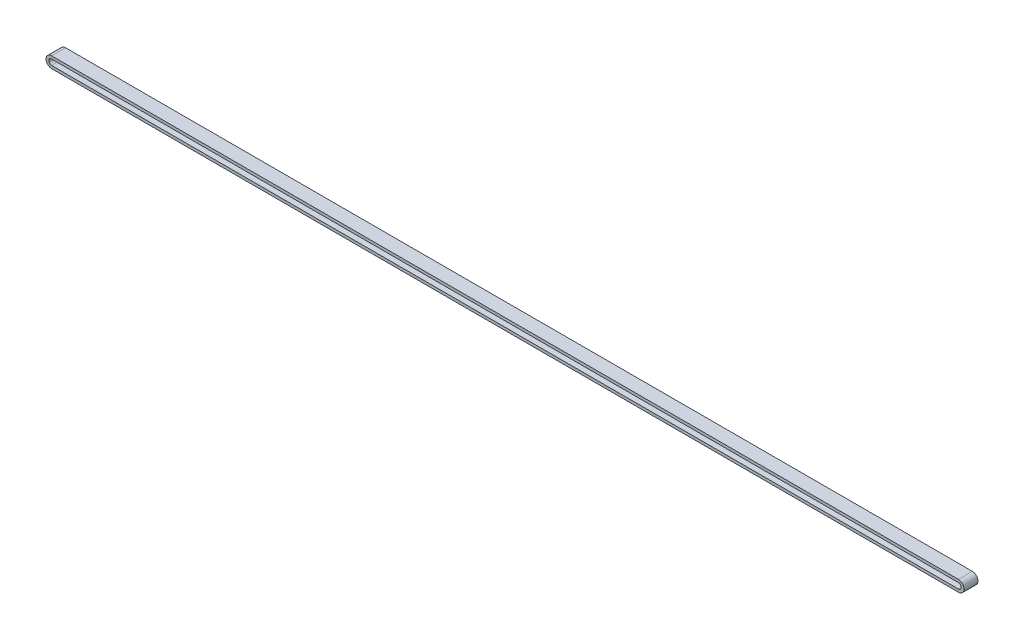
ISO-10303-21;
HEADER;
FILE_DESCRIPTION(('STEP AP214'),'2;1');
FILE_NAME('part.step','',(''),(''),'','','');
FILE_SCHEMA(('AUTOMOTIVE_DESIGN { 1 0 10303 214 1 1 1 1 }'));
ENDSEC;
DATA;
#1=APPLICATION_CONTEXT('core data for automotive mechanical design processes');
#2=APPLICATION_PROTOCOL_DEFINITION('international standard','automotive_design',2000,#1);
#3=PRODUCT_CONTEXT('',#1,'mechanical');
#4=PRODUCT('Part','Part','',(#3));
#5=PRODUCT_RELATED_PRODUCT_CATEGORY('part','',(#4));
#6=PRODUCT_DEFINITION_FORMATION('','',#4);
#7=PRODUCT_DEFINITION_CONTEXT('part definition',#1,'design');
#8=PRODUCT_DEFINITION('design','',#6,#7);
#9=PRODUCT_DEFINITION_SHAPE('','',#8);
#10=(LENGTH_UNIT() NAMED_UNIT(*) SI_UNIT(.MILLI.,.METRE.));
#11=(NAMED_UNIT(*) PLANE_ANGLE_UNIT() SI_UNIT($,.RADIAN.));
#12=(NAMED_UNIT(*) SI_UNIT($,.STERADIAN.) SOLID_ANGLE_UNIT());
#13=UNCERTAINTY_MEASURE_WITH_UNIT(LENGTH_MEASURE(1.E-05),#10,'distance_accuracy_value','');
#14=(GEOMETRIC_REPRESENTATION_CONTEXT(3) GLOBAL_UNCERTAINTY_ASSIGNED_CONTEXT((#13)) GLOBAL_UNIT_ASSIGNED_CONTEXT((#10,
#11,#12)) REPRESENTATION_CONTEXT('',''));
#15=CARTESIAN_POINT('',(0.,0.,0.));
#16=DIRECTION('',(0.,0.,1.));
#17=DIRECTION('',(1.,0.,0.));
#18=AXIS2_PLACEMENT_3D('',#15,#16,#17);
#19=CARTESIAN_POINT('',(0.,0.,5.));
#20=DIRECTION('',(0.,0.,-1.));
#21=DIRECTION('',(-1.,0.,0.));
#22=AXIS2_PLACEMENT_3D('',#19,#20,#21);
#23=CYLINDRICAL_SURFACE('',#22,2.);
#24=CARTESIAN_POINT('',(0.,0.,0.));
#25=DIRECTION('',(0.,0.,1.));
#26=DIRECTION('',(1.,0.,0.));
#27=AXIS2_PLACEMENT_3D('',#24,#25,#26);
#28=CIRCLE('',#27,2.);
#29=CARTESIAN_POINT('',(0.,2.,0.));
#30=VERTEX_POINT('',#29);
#31=CARTESIAN_POINT('',(0.,-2.,0.));
#32=VERTEX_POINT('',#31);
#33=EDGE_CURVE('E143',#30,#32,#28,.T.);
#34=ORIENTED_EDGE('',*,*,#33,.T.);
#35=DIRECTION('',(0.,0.,-1.));
#36=VECTOR('',#35,1.);
#37=CARTESIAN_POINT('',(0.,-2.,5.));
#38=LINE('',#37,#36);
#39=CARTESIAN_POINT('',(0.,-2.,5.));
#40=VERTEX_POINT('',#39);
#41=EDGE_CURVE('E11',#40,#32,#38,.T.);
#42=ORIENTED_EDGE('',*,*,#41,.F.);
#43=CARTESIAN_POINT('',(0.,0.,5.));
#44=DIRECTION('',(0.,0.,1.));
#45=DIRECTION('',(1.,0.,0.));
#46=AXIS2_PLACEMENT_3D('',#43,#44,#45);
#47=CIRCLE('',#46,2.);
#48=CARTESIAN_POINT('',(0.,2.,5.));
#49=VERTEX_POINT('',#48);
#50=EDGE_CURVE('E114',#49,#40,#47,.T.);
#51=ORIENTED_EDGE('',*,*,#50,.F.);
#52=DIRECTION('',(0.,0.,-1.));
#53=VECTOR('',#52,1.);
#54=CARTESIAN_POINT('',(0.,2.,5.));
#55=LINE('',#54,#53);
#56=EDGE_CURVE('E54',#49,#30,#55,.T.);
#57=ORIENTED_EDGE('',*,*,#56,.T.);
#58=EDGE_LOOP('',(#34,#42,#51,#57));
#59=FACE_BOUND('',#58,.T.);
#60=ADVANCED_FACE('F35',(#59),#23,.T.);
#61=CARTESIAN_POINT('',(0.,-2.,5.));
#62=DIRECTION('',(0.,1.,0.));
#63=DIRECTION('',(0.,0.,1.));
#64=AXIS2_PLACEMENT_3D('',#61,#62,#63);
#65=PLANE('',#64);
#66=DIRECTION('',(1.,0.,0.));
#67=VECTOR('',#66,1.);
#68=CARTESIAN_POINT('',(0.,-2.,0.));
#69=LINE('',#68,#67);
#70=CARTESIAN_POINT('',(325.00227405,-2.,0.));
#71=VERTEX_POINT('',#70);
#72=EDGE_CURVE('E120',#32,#71,#69,.T.);
#73=ORIENTED_EDGE('',*,*,#72,.T.);
#74=DIRECTION('',(0.,0.,-1.));
#75=VECTOR('',#74,1.);
#76=CARTESIAN_POINT('',(325.00227405,-2.,5.));
#77=LINE('',#76,#75);
#78=CARTESIAN_POINT('',(325.00227405,-2.,5.));
#79=VERTEX_POINT('',#78);
#80=EDGE_CURVE('E45',#79,#71,#77,.T.);
#81=ORIENTED_EDGE('',*,*,#80,.F.);
#82=DIRECTION('',(1.,0.,0.));
#83=VECTOR('',#82,1.);
#84=CARTESIAN_POINT('',(0.,-2.,5.));
#85=LINE('',#84,#83);
#86=EDGE_CURVE('E108',#40,#79,#85,.T.);
#87=ORIENTED_EDGE('',*,*,#86,.F.);
#88=ORIENTED_EDGE('',*,*,#41,.T.);
#89=EDGE_LOOP('',(#73,#81,#87,#88));
#90=FACE_BOUND('',#89,.T.);
#91=ADVANCED_FACE('F119',(#90),#65,.F.);
#92=CARTESIAN_POINT('',(325.00227405,0.,5.));
#93=DIRECTION('',(0.,0.,-1.));
#94=DIRECTION('',(-1.,0.,0.));
#95=AXIS2_PLACEMENT_3D('',#92,#93,#94);
#96=CYLINDRICAL_SURFACE('',#95,2.);
#97=CARTESIAN_POINT('',(325.00227405,0.,0.));
#98=DIRECTION('',(0.,0.,1.));
#99=DIRECTION('',(1.,0.,0.));
#100=AXIS2_PLACEMENT_3D('',#97,#98,#99);
#101=CIRCLE('',#100,2.);
#102=CARTESIAN_POINT('',(325.00227405,2.,0.));
#103=VERTEX_POINT('',#102);
#104=EDGE_CURVE('E146',#71,#103,#101,.T.);
#105=ORIENTED_EDGE('',*,*,#104,.T.);
#106=DIRECTION('',(0.,0.,-1.));
#107=VECTOR('',#106,1.);
#108=CARTESIAN_POINT('',(325.00227405,2.,5.));
#109=LINE('',#108,#107);
#110=CARTESIAN_POINT('',(325.00227405,2.,5.));
#111=VERTEX_POINT('',#110);
#112=EDGE_CURVE('E81',#111,#103,#109,.T.);
#113=ORIENTED_EDGE('',*,*,#112,.F.);
#114=CARTESIAN_POINT('',(325.00227405,0.,5.));
#115=DIRECTION('',(0.,0.,1.));
#116=DIRECTION('',(1.,0.,0.));
#117=AXIS2_PLACEMENT_3D('',#114,#115,#116);
#118=CIRCLE('',#117,2.);
#119=EDGE_CURVE('E113',#79,#111,#118,.T.);
#120=ORIENTED_EDGE('',*,*,#119,.F.);
#121=ORIENTED_EDGE('',*,*,#80,.T.);
#122=EDGE_LOOP('',(#105,#113,#120,#121));
#123=FACE_BOUND('',#122,.T.);
#124=ADVANCED_FACE('F124',(#123),#96,.T.);
#125=CARTESIAN_POINT('',(0.,-1.,5.));
#126=DIRECTION('',(0.,1.,0.));
#127=DIRECTION('',(-1.,0.,0.));
#128=AXIS2_PLACEMENT_3D('',#125,#126,#127);
#129=PLANE('',#128);
#130=DIRECTION('',(1.,0.,0.));
#131=VECTOR('',#130,1.);
#132=CARTESIAN_POINT('',(0.,-1.,0.));
#133=LINE('',#132,#131);
#134=CARTESIAN_POINT('',(0.,-1.,0.));
#135=VERTEX_POINT('',#134);
#136=CARTESIAN_POINT('',(325.00227405,-0.999999999999998,0.));
#137=VERTEX_POINT('',#136);
#138=EDGE_CURVE('E131',#135,#137,#133,.T.);
#139=ORIENTED_EDGE('',*,*,#138,.F.);
#140=DIRECTION('',(0.,0.,-1.));
#141=VECTOR('',#140,1.);
#142=CARTESIAN_POINT('',(0.,-1.,5.));
#143=LINE('',#142,#141);
#144=CARTESIAN_POINT('',(0.,-1.,5.));
#145=VERTEX_POINT('',#144);
#146=EDGE_CURVE('E39',#145,#135,#143,.T.);
#147=ORIENTED_EDGE('',*,*,#146,.F.);
#148=DIRECTION('',(1.,0.,0.));
#149=VECTOR('',#148,1.);
#150=CARTESIAN_POINT('',(0.,-1.,5.));
#151=LINE('',#150,#149);
#152=CARTESIAN_POINT('',(325.00227405,-0.999999999999998,5.));
#153=VERTEX_POINT('',#152);
#154=EDGE_CURVE('E151',#145,#153,#151,.T.);
#155=ORIENTED_EDGE('',*,*,#154,.T.);
#156=DIRECTION('',(0.,0.,-1.));
#157=VECTOR('',#156,1.);
#158=CARTESIAN_POINT('',(325.00227405,-0.999999999999998,5.));
#159=LINE('',#158,#157);
#160=EDGE_CURVE('E127',#153,#137,#159,.T.);
#161=ORIENTED_EDGE('',*,*,#160,.T.);
#162=EDGE_LOOP('',(#139,#147,#155,#161));
#163=FACE_BOUND('',#162,.T.);
#164=ADVANCED_FACE('F37',(#163),#129,.T.);
#165=CARTESIAN_POINT('',(0.,0.,5.));
#166=DIRECTION('',(0.,0.,-1.));
#167=DIRECTION('',(-1.,0.,0.));
#168=AXIS2_PLACEMENT_3D('',#165,#166,#167);
#169=CYLINDRICAL_SURFACE('',#168,1.);
#170=CARTESIAN_POINT('',(0.,0.,0.));
#171=DIRECTION('',(0.,0.,1.));
#172=DIRECTION('',(1.,0.,0.));
#173=AXIS2_PLACEMENT_3D('',#170,#171,#172);
#174=CIRCLE('',#173,1.);
#175=CARTESIAN_POINT('',(0.,1.,0.));
#176=VERTEX_POINT('',#175);
#177=EDGE_CURVE('E134',#176,#135,#174,.T.);
#178=ORIENTED_EDGE('',*,*,#177,.F.);
#179=DIRECTION('',(0.,0.,-1.));
#180=VECTOR('',#179,1.);
#181=CARTESIAN_POINT('',(0.,1.,5.));
#182=LINE('',#181,#180);
#183=CARTESIAN_POINT('',(0.,1.,5.));
#184=VERTEX_POINT('',#183);
#185=EDGE_CURVE('E156',#184,#176,#182,.T.);
#186=ORIENTED_EDGE('',*,*,#185,.F.);
#187=CARTESIAN_POINT('',(0.,0.,5.));
#188=DIRECTION('',(0.,0.,1.));
#189=DIRECTION('',(1.,0.,0.));
#190=AXIS2_PLACEMENT_3D('',#187,#188,#189);
#191=CIRCLE('',#190,1.);
#192=EDGE_CURVE('E165',#184,#145,#191,.T.);
#193=ORIENTED_EDGE('',*,*,#192,.T.);
#194=ORIENTED_EDGE('',*,*,#146,.T.);
#195=EDGE_LOOP('',(#178,#186,#193,#194));
#196=FACE_BOUND('',#195,.T.);
#197=ADVANCED_FACE('F163',(#196),#169,.F.);
#198=CARTESIAN_POINT('',(0.,1.,5.));
#199=DIRECTION('',(0.,1.,0.));
#200=DIRECTION('',(-1.,0.,0.));
#201=AXIS2_PLACEMENT_3D('',#198,#199,#200);
#202=PLANE('',#201);
#203=DIRECTION('',(1.,0.,0.));
#204=VECTOR('',#203,1.);
#205=CARTESIAN_POINT('',(0.,1.,0.));
#206=LINE('',#205,#204);
#207=CARTESIAN_POINT('',(325.00227405,0.999999999999998,0.));
#208=VERTEX_POINT('',#207);
#209=EDGE_CURVE('E137',#176,#208,#206,.T.);
#210=ORIENTED_EDGE('',*,*,#209,.T.);
#211=DIRECTION('',(0.,0.,-1.));
#212=VECTOR('',#211,1.);
#213=CARTESIAN_POINT('',(325.00227405,0.999999999999998,5.));
#214=LINE('',#213,#212);
#215=CARTESIAN_POINT('',(325.00227405,0.999999999999998,5.));
#216=VERTEX_POINT('',#215);
#217=EDGE_CURVE('E155',#216,#208,#214,.T.);
#218=ORIENTED_EDGE('',*,*,#217,.F.);
#219=DIRECTION('',(1.,0.,0.));
#220=VECTOR('',#219,1.);
#221=CARTESIAN_POINT('',(0.,1.,5.));
#222=LINE('',#221,#220);
#223=EDGE_CURVE('E173',#184,#216,#222,.T.);
#224=ORIENTED_EDGE('',*,*,#223,.F.);
#225=ORIENTED_EDGE('',*,*,#185,.T.);
#226=EDGE_LOOP('',(#210,#218,#224,#225));
#227=FACE_BOUND('',#226,.T.);
#228=ADVANCED_FACE('F171',(#227),#202,.F.);
#229=CARTESIAN_POINT('',(325.00227405,0.,5.));
#230=DIRECTION('',(0.,0.,-1.));
#231=DIRECTION('',(-1.,0.,0.));
#232=AXIS2_PLACEMENT_3D('',#229,#230,#231);
#233=CYLINDRICAL_SURFACE('',#232,0.999999999999998);
#234=CARTESIAN_POINT('',(325.00227405,0.,0.));
#235=DIRECTION('',(0.,0.,1.));
#236=DIRECTION('',(1.,0.,0.));
#237=AXIS2_PLACEMENT_3D('',#234,#235,#236);
#238=CIRCLE('',#237,0.999999999999998);
#239=EDGE_CURVE('E140',#137,#208,#238,.T.);
#240=ORIENTED_EDGE('',*,*,#239,.F.);
#241=ORIENTED_EDGE('',*,*,#160,.F.);
#242=CARTESIAN_POINT('',(325.00227405,0.,5.));
#243=DIRECTION('',(0.,0.,1.));
#244=DIRECTION('',(1.,0.,0.));
#245=AXIS2_PLACEMENT_3D('',#242,#243,#244);
#246=CIRCLE('',#245,0.999999999999998);
#247=EDGE_CURVE('E176',#153,#216,#246,.T.);
#248=ORIENTED_EDGE('',*,*,#247,.T.);
#249=ORIENTED_EDGE('',*,*,#217,.T.);
#250=EDGE_LOOP('',(#240,#241,#248,#249));
#251=FACE_BOUND('',#250,.T.);
#252=ADVANCED_FACE('F177',(#251),#233,.F.);
#253=CARTESIAN_POINT('',(0.,2.,5.));
#254=DIRECTION('',(0.,1.,0.));
#255=DIRECTION('',(0.,0.,1.));
#256=AXIS2_PLACEMENT_3D('',#253,#254,#255);
#257=PLANE('',#256);
#258=DIRECTION('',(1.,0.,0.));
#259=VECTOR('',#258,1.);
#260=CARTESIAN_POINT('',(0.,2.,0.));
#261=LINE('',#260,#259);
#262=EDGE_CURVE('E148',#30,#103,#261,.T.);
#263=ORIENTED_EDGE('',*,*,#262,.F.);
#264=ORIENTED_EDGE('',*,*,#56,.F.);
#265=DIRECTION('',(1.,0.,0.));
#266=VECTOR('',#265,1.);
#267=CARTESIAN_POINT('',(0.,2.,5.));
#268=LINE('',#267,#266);
#269=EDGE_CURVE('E125',#49,#111,#268,.T.);
#270=ORIENTED_EDGE('',*,*,#269,.T.);
#271=ORIENTED_EDGE('',*,*,#112,.T.);
#272=EDGE_LOOP('',(#263,#264,#270,#271));
#273=FACE_BOUND('',#272,.T.);
#274=ADVANCED_FACE('F184',(#273),#257,.T.);
#275=CARTESIAN_POINT('',(0.,0.,5.));
#276=DIRECTION('',(0.,0.,1.));
#277=DIRECTION('',(1.,0.,0.));
#278=AXIS2_PLACEMENT_3D('',#275,#276,#277);
#279=PLANE('',#278);
#280=ORIENTED_EDGE('',*,*,#154,.F.);
#281=ORIENTED_EDGE('',*,*,#192,.F.);
#282=ORIENTED_EDGE('',*,*,#223,.T.);
#283=ORIENTED_EDGE('',*,*,#247,.F.);
#284=EDGE_LOOP('',(#280,#281,#282,#283));
#285=FACE_BOUND('',#284,.T.);
#286=ORIENTED_EDGE('',*,*,#50,.T.);
#287=ORIENTED_EDGE('',*,*,#86,.T.);
#288=ORIENTED_EDGE('',*,*,#119,.T.);
#289=ORIENTED_EDGE('',*,*,#269,.F.);
#290=EDGE_LOOP('',(#286,#287,#288,#289));
#291=FACE_BOUND('',#290,.T.);
#292=ADVANCED_FACE('F110',(#285,#291),#279,.T.);
#293=CARTESIAN_POINT('',(0.,0.,0.));
#294=DIRECTION('',(0.,0.,1.));
#295=DIRECTION('',(1.,0.,0.));
#296=AXIS2_PLACEMENT_3D('',#293,#294,#295);
#297=PLANE('',#296);
#298=ORIENTED_EDGE('',*,*,#138,.T.);
#299=ORIENTED_EDGE('',*,*,#239,.T.);
#300=ORIENTED_EDGE('',*,*,#209,.F.);
#301=ORIENTED_EDGE('',*,*,#177,.T.);
#302=EDGE_LOOP('',(#298,#299,#300,#301));
#303=FACE_BOUND('',#302,.T.);
#304=ORIENTED_EDGE('',*,*,#33,.F.);
#305=ORIENTED_EDGE('',*,*,#262,.T.);
#306=ORIENTED_EDGE('',*,*,#104,.F.);
#307=ORIENTED_EDGE('',*,*,#72,.F.);
#308=EDGE_LOOP('',(#304,#305,#306,#307));
#309=FACE_BOUND('',#308,.T.);
#310=ADVANCED_FACE('F168',(#303,#309),#297,.F.);
#311=CLOSED_SHELL('',(#60,#91,#124,#164,#197,#228,#252,#274,#292,#310));
#312=MANIFOLD_SOLID_BREP('B2',#311);
#313=ADVANCED_BREP_SHAPE_REPRESENTATION('',(#18,#312),#14);
#314=SHAPE_DEFINITION_REPRESENTATION(#9,#313);
ENDSEC;
END-ISO-10303-21;
